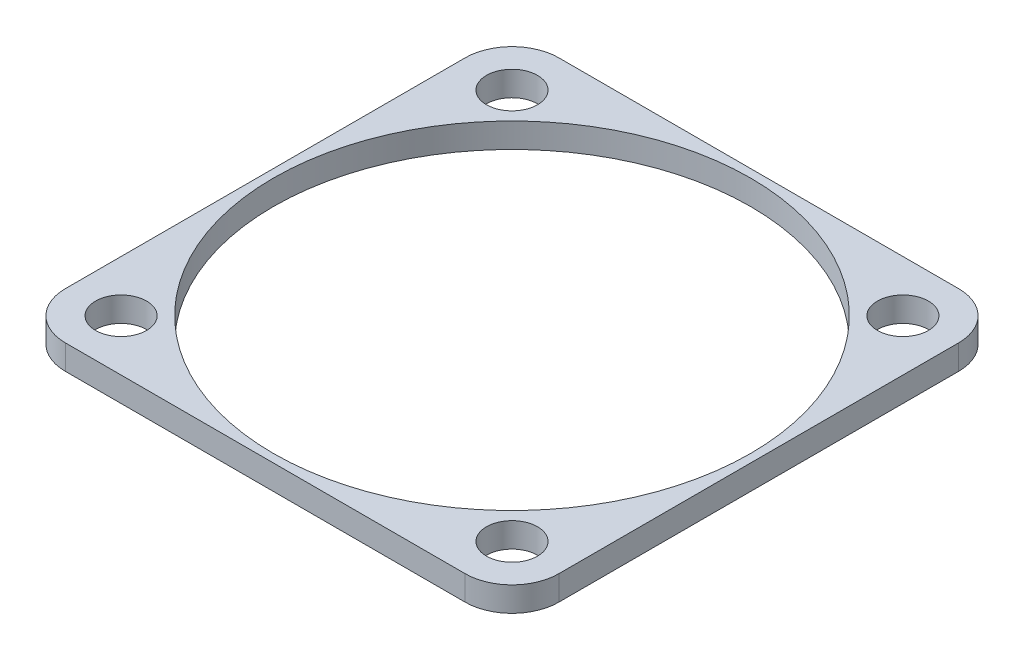
ISO-10303-21;
HEADER;
FILE_DESCRIPTION(('STEP AP214'),'2;1');
FILE_NAME('part.step','',(''),(''),'','','');
FILE_SCHEMA(('AUTOMOTIVE_DESIGN { 1 0 10303 214 1 1 1 1 }'));
ENDSEC;
DATA;
#1=APPLICATION_CONTEXT('core data for automotive mechanical design processes');
#2=APPLICATION_PROTOCOL_DEFINITION('international standard','automotive_design',2000,#1);
#3=PRODUCT_CONTEXT('',#1,'mechanical');
#4=PRODUCT('Part','Part','',(#3));
#5=PRODUCT_RELATED_PRODUCT_CATEGORY('part','',(#4));
#6=PRODUCT_DEFINITION_FORMATION('','',#4);
#7=PRODUCT_DEFINITION_CONTEXT('part definition',#1,'design');
#8=PRODUCT_DEFINITION('design','',#6,#7);
#9=PRODUCT_DEFINITION_SHAPE('','',#8);
#10=(LENGTH_UNIT() NAMED_UNIT(*) SI_UNIT(.MILLI.,.METRE.));
#11=(NAMED_UNIT(*) PLANE_ANGLE_UNIT() SI_UNIT($,.RADIAN.));
#12=(NAMED_UNIT(*) SI_UNIT($,.STERADIAN.) SOLID_ANGLE_UNIT());
#13=UNCERTAINTY_MEASURE_WITH_UNIT(LENGTH_MEASURE(1.E-05),#10,'distance_accuracy_value','');
#14=(GEOMETRIC_REPRESENTATION_CONTEXT(3) GLOBAL_UNCERTAINTY_ASSIGNED_CONTEXT((#13)) GLOBAL_UNIT_ASSIGNED_CONTEXT((#10,
#11,#12)) REPRESENTATION_CONTEXT('',''));
#15=CARTESIAN_POINT('',(0.,0.,0.));
#16=DIRECTION('',(0.,0.,1.));
#17=DIRECTION('',(1.,0.,0.));
#18=AXIS2_PLACEMENT_3D('',#15,#16,#17);
#19=CARTESIAN_POINT('',(0.,1.5,0.));
#20=DIRECTION('',(0.,-1.,0.));
#21=DIRECTION('',(0.,0.,-1.));
#22=AXIS2_PLACEMENT_3D('',#19,#20,#21);
#23=PLANE('',#22);
#24=DIRECTION('',(0.,0.,-1.));
#25=VECTOR('',#24,1.);
#26=CARTESIAN_POINT('',(14.9999999999998,1.5,-15.0000000000001));
#27=LINE('',#26,#25);
#28=CARTESIAN_POINT('',(14.9999999999996,1.5,12.15));
#29=VERTEX_POINT('',#28);
#30=CARTESIAN_POINT('',(14.9999999999997,1.5,-12.15));
#31=VERTEX_POINT('',#30);
#32=EDGE_CURVE('E194',#29,#31,#27,.T.);
#33=ORIENTED_EDGE('',*,*,#32,.T.);
#34=CARTESIAN_POINT('',(12.1499999999997,1.5,-12.15));
#35=DIRECTION('',(0.,-1.,0.));
#36=DIRECTION('',(0.,0.,-1.));
#37=AXIS2_PLACEMENT_3D('',#34,#35,#36);
#38=CIRCLE('',#37,2.85);
#39=CARTESIAN_POINT('',(12.1499999999997,1.5,-15.));
#40=VERTEX_POINT('',#39);
#41=EDGE_CURVE('E167',#31,#40,#38,.F.);
#42=ORIENTED_EDGE('',*,*,#41,.T.);
#43=DIRECTION('',(-1.,0.,0.));
#44=VECTOR('',#43,1.);
#45=CARTESIAN_POINT('',(-15.,1.5,-14.9999999999999));
#46=LINE('',#45,#44);
#47=CARTESIAN_POINT('',(-12.15,1.5,-14.9999999999999));
#48=VERTEX_POINT('',#47);
#49=EDGE_CURVE('E124',#40,#48,#46,.T.);
#50=ORIENTED_EDGE('',*,*,#49,.T.);
#51=CARTESIAN_POINT('',(-12.15,1.5,-12.1499999999999));
#52=DIRECTION('',(0.,-1.,0.));
#53=DIRECTION('',(0.,0.,-1.));
#54=AXIS2_PLACEMENT_3D('',#51,#52,#53);
#55=CIRCLE('',#54,2.85);
#56=CARTESIAN_POINT('',(-15.,1.5,-12.1499999999999));
#57=VERTEX_POINT('',#56);
#58=EDGE_CURVE('E59',#48,#57,#55,.F.);
#59=ORIENTED_EDGE('',*,*,#58,.T.);
#60=DIRECTION('',(0.,0.,1.));
#61=VECTOR('',#60,1.);
#62=CARTESIAN_POINT('',(-15.,1.5,-14.9999999999999));
#63=LINE('',#62,#61);
#64=CARTESIAN_POINT('',(-15.,1.5,12.15));
#65=VERTEX_POINT('',#64);
#66=EDGE_CURVE('E145',#57,#65,#63,.T.);
#67=ORIENTED_EDGE('',*,*,#66,.T.);
#68=CARTESIAN_POINT('',(-12.15,1.5,12.15));
#69=DIRECTION('',(0.,-1.,0.));
#70=DIRECTION('',(0.,0.,-1.));
#71=AXIS2_PLACEMENT_3D('',#68,#69,#70);
#72=CIRCLE('',#71,2.85);
#73=CARTESIAN_POINT('',(-12.15,1.5,15.));
#74=VERTEX_POINT('',#73);
#75=EDGE_CURVE('E161',#65,#74,#72,.F.);
#76=ORIENTED_EDGE('',*,*,#75,.T.);
#77=DIRECTION('',(1.,0.,0.));
#78=VECTOR('',#77,1.);
#79=CARTESIAN_POINT('',(-15.,1.5,15.));
#80=LINE('',#79,#78);
#81=CARTESIAN_POINT('',(12.1499999999996,1.5,15.));
#82=VERTEX_POINT('',#81);
#83=EDGE_CURVE('E138',#74,#82,#80,.T.);
#84=ORIENTED_EDGE('',*,*,#83,.T.);
#85=CARTESIAN_POINT('',(12.1499999999996,1.5,12.15));
#86=DIRECTION('',(0.,-1.,0.));
#87=DIRECTION('',(0.,0.,-1.));
#88=AXIS2_PLACEMENT_3D('',#85,#86,#87);
#89=CIRCLE('',#88,2.85);
#90=EDGE_CURVE('E164',#82,#29,#89,.F.);
#91=ORIENTED_EDGE('',*,*,#90,.T.);
#92=EDGE_LOOP('',(#33,#42,#50,#59,#67,#76,#84,#91));
#93=FACE_BOUND('',#92,.T.);
#94=CARTESIAN_POINT('',(0.,1.5,0.));
#95=DIRECTION('',(0.,1.,0.));
#96=DIRECTION('',(0.,0.,1.));
#97=AXIS2_PLACEMENT_3D('',#94,#95,#96);
#98=CIRCLE('',#97,14.5);
#99=CARTESIAN_POINT('',(0.,1.5,14.5));
#100=VERTEX_POINT('',#99);
#101=EDGE_CURVE('E207',#100,#100,#98,.T.);
#102=ORIENTED_EDGE('',*,*,#101,.F.);
#103=EDGE_LOOP('',(#102));
#104=FACE_BOUND('',#103,.T.);
#105=CARTESIAN_POINT('',(-11.879393923934,1.5,-11.879393923934));
#106=DIRECTION('',(0.,1.,0.));
#107=DIRECTION('',(0.,0.,1.));
#108=AXIS2_PLACEMENT_3D('',#105,#106,#107);
#109=CIRCLE('',#108,1.55);
#110=CARTESIAN_POINT('',(-11.879393923934,1.5,-10.329393923934));
#111=VERTEX_POINT('',#110);
#112=EDGE_CURVE('E214',#111,#111,#109,.T.);
#113=ORIENTED_EDGE('',*,*,#112,.F.);
#114=EDGE_LOOP('',(#113));
#115=FACE_BOUND('',#114,.T.);
#116=CARTESIAN_POINT('',(11.879393923934,1.5,-11.8793939239346));
#117=DIRECTION('',(0.,1.,0.));
#118=DIRECTION('',(0.,0.,1.));
#119=AXIS2_PLACEMENT_3D('',#116,#117,#118);
#120=CIRCLE('',#119,1.55000000000069);
#121=CARTESIAN_POINT('',(11.879393923934,1.5,-10.329393923934));
#122=VERTEX_POINT('',#121);
#123=EDGE_CURVE('E220',#122,#122,#120,.T.);
#124=ORIENTED_EDGE('',*,*,#123,.F.);
#125=EDGE_LOOP('',(#124));
#126=FACE_BOUND('',#125,.T.);
#127=CARTESIAN_POINT('',(11.8793939239347,1.5,11.8793939239333));
#128=DIRECTION('',(0.,1.,0.));
#129=DIRECTION('',(0.,0.,1.));
#130=AXIS2_PLACEMENT_3D('',#127,#128,#129);
#131=CIRCLE('',#130,1.55000000000094);
#132=CARTESIAN_POINT('',(11.8793939239347,1.5,13.4293939239343));
#133=VERTEX_POINT('',#132);
#134=EDGE_CURVE('E228',#133,#133,#131,.T.);
#135=ORIENTED_EDGE('',*,*,#134,.F.);
#136=EDGE_LOOP('',(#135));
#137=FACE_BOUND('',#136,.T.);
#138=CARTESIAN_POINT('',(-11.8793939239333,1.5,11.879393923934));
#139=DIRECTION('',(0.,1.,0.));
#140=DIRECTION('',(0.,0.,1.));
#141=AXIS2_PLACEMENT_3D('',#138,#139,#140);
#142=CIRCLE('',#141,1.55000000000035);
#143=CARTESIAN_POINT('',(-11.8793939239333,1.5,13.4293939239343));
#144=VERTEX_POINT('',#143);
#145=EDGE_CURVE('E236',#144,#144,#142,.T.);
#146=ORIENTED_EDGE('',*,*,#145,.F.);
#147=EDGE_LOOP('',(#146));
#148=FACE_BOUND('',#147,.T.);
#149=ADVANCED_FACE('F38',(#93,#104,#115,#126,#137,#148),#23,.F.);
#150=CARTESIAN_POINT('',(0.,0.,0.));
#151=DIRECTION('',(0.,-1.,0.));
#152=DIRECTION('',(0.,0.,-1.));
#153=AXIS2_PLACEMENT_3D('',#150,#151,#152);
#154=PLANE('',#153);
#155=CARTESIAN_POINT('',(11.8793939239347,0.,11.8793939239333));
#156=DIRECTION('',(0.,1.,0.));
#157=DIRECTION('',(0.,0.,1.));
#158=AXIS2_PLACEMENT_3D('',#155,#156,#157);
#159=CIRCLE('',#158,1.55000000000094);
#160=CARTESIAN_POINT('',(11.8793939239347,0.,13.4293939239343));
#161=VERTEX_POINT('',#160);
#162=EDGE_CURVE('E232',#161,#161,#159,.T.);
#163=ORIENTED_EDGE('',*,*,#162,.T.);
#164=EDGE_LOOP('',(#163));
#165=FACE_BOUND('',#164,.T.);
#166=CARTESIAN_POINT('',(-11.879393923934,0.,-11.879393923934));
#167=DIRECTION('',(0.,1.,0.));
#168=DIRECTION('',(0.,0.,1.));
#169=AXIS2_PLACEMENT_3D('',#166,#167,#168);
#170=CIRCLE('',#169,1.55);
#171=CARTESIAN_POINT('',(-11.879393923934,0.,-10.329393923934));
#172=VERTEX_POINT('',#171);
#173=EDGE_CURVE('E216',#172,#172,#170,.T.);
#174=ORIENTED_EDGE('',*,*,#173,.T.);
#175=EDGE_LOOP('',(#174));
#176=FACE_BOUND('',#175,.T.);
#177=DIRECTION('',(-1.,0.,0.));
#178=VECTOR('',#177,1.);
#179=CARTESIAN_POINT('',(-15.,0.,-14.9999999999999));
#180=LINE('',#179,#178);
#181=CARTESIAN_POINT('',(12.1499999999997,0.,-15.));
#182=VERTEX_POINT('',#181);
#183=CARTESIAN_POINT('',(-12.15,0.,-14.9999999999999));
#184=VERTEX_POINT('',#183);
#185=EDGE_CURVE('E122',#182,#184,#180,.T.);
#186=ORIENTED_EDGE('',*,*,#185,.F.);
#187=CARTESIAN_POINT('',(12.1499999999997,0.,-12.15));
#188=DIRECTION('',(0.,-1.,0.));
#189=DIRECTION('',(0.,0.,-1.));
#190=AXIS2_PLACEMENT_3D('',#187,#188,#189);
#191=CIRCLE('',#190,2.85);
#192=CARTESIAN_POINT('',(14.9999999999997,0.,-12.15));
#193=VERTEX_POINT('',#192);
#194=EDGE_CURVE('E104',#182,#193,#191,.T.);
#195=ORIENTED_EDGE('',*,*,#194,.T.);
#196=DIRECTION('',(0.,0.,-1.));
#197=VECTOR('',#196,1.);
#198=CARTESIAN_POINT('',(14.9999999999998,0.,-15.0000000000001));
#199=LINE('',#198,#197);
#200=CARTESIAN_POINT('',(14.9999999999996,0.,12.15));
#201=VERTEX_POINT('',#200);
#202=EDGE_CURVE('E134',#201,#193,#199,.T.);
#203=ORIENTED_EDGE('',*,*,#202,.F.);
#204=CARTESIAN_POINT('',(12.1499999999996,0.,12.15));
#205=DIRECTION('',(0.,-1.,0.));
#206=DIRECTION('',(0.,0.,-1.));
#207=AXIS2_PLACEMENT_3D('',#204,#205,#206);
#208=CIRCLE('',#207,2.85);
#209=CARTESIAN_POINT('',(12.1499999999996,0.,15.));
#210=VERTEX_POINT('',#209);
#211=EDGE_CURVE('E116',#201,#210,#208,.T.);
#212=ORIENTED_EDGE('',*,*,#211,.T.);
#213=DIRECTION('',(1.,0.,0.));
#214=VECTOR('',#213,1.);
#215=CARTESIAN_POINT('',(-15.,0.,15.));
#216=LINE('',#215,#214);
#217=CARTESIAN_POINT('',(-12.15,0.,15.));
#218=VERTEX_POINT('',#217);
#219=EDGE_CURVE('E140',#218,#210,#216,.T.);
#220=ORIENTED_EDGE('',*,*,#219,.F.);
#221=CARTESIAN_POINT('',(-12.15,0.,12.15));
#222=DIRECTION('',(0.,-1.,0.));
#223=DIRECTION('',(0.,0.,-1.));
#224=AXIS2_PLACEMENT_3D('',#221,#222,#223);
#225=CIRCLE('',#224,2.85);
#226=CARTESIAN_POINT('',(-15.,0.,12.15));
#227=VERTEX_POINT('',#226);
#228=EDGE_CURVE('E149',#218,#227,#225,.T.);
#229=ORIENTED_EDGE('',*,*,#228,.T.);
#230=DIRECTION('',(0.,0.,1.));
#231=VECTOR('',#230,1.);
#232=CARTESIAN_POINT('',(-15.,0.,-14.9999999999999));
#233=LINE('',#232,#231);
#234=CARTESIAN_POINT('',(-15.,0.,-12.1499999999999));
#235=VERTEX_POINT('',#234);
#236=EDGE_CURVE('E133',#235,#227,#233,.T.);
#237=ORIENTED_EDGE('',*,*,#236,.F.);
#238=CARTESIAN_POINT('',(-12.15,0.,-12.1499999999999));
#239=DIRECTION('',(0.,-1.,0.));
#240=DIRECTION('',(0.,0.,-1.));
#241=AXIS2_PLACEMENT_3D('',#238,#239,#240);
#242=CIRCLE('',#241,2.85);
#243=EDGE_CURVE('E126',#235,#184,#242,.T.);
#244=ORIENTED_EDGE('',*,*,#243,.T.);
#245=EDGE_LOOP('',(#186,#195,#203,#212,#220,#229,#237,#244));
#246=FACE_BOUND('',#245,.T.);
#247=CARTESIAN_POINT('',(0.,0.,0.));
#248=DIRECTION('',(0.,1.,0.));
#249=DIRECTION('',(0.,0.,1.));
#250=AXIS2_PLACEMENT_3D('',#247,#248,#249);
#251=CIRCLE('',#250,14.5);
#252=CARTESIAN_POINT('',(0.,0.,14.5));
#253=VERTEX_POINT('',#252);
#254=EDGE_CURVE('E200',#253,#253,#251,.T.);
#255=ORIENTED_EDGE('',*,*,#254,.T.);
#256=EDGE_LOOP('',(#255));
#257=FACE_BOUND('',#256,.T.);
#258=CARTESIAN_POINT('',(11.879393923934,0.,-11.8793939239346));
#259=DIRECTION('',(0.,1.,0.));
#260=DIRECTION('',(0.,0.,1.));
#261=AXIS2_PLACEMENT_3D('',#258,#259,#260);
#262=CIRCLE('',#261,1.55000000000069);
#263=CARTESIAN_POINT('',(11.879393923934,0.,-10.329393923934));
#264=VERTEX_POINT('',#263);
#265=EDGE_CURVE('E224',#264,#264,#262,.T.);
#266=ORIENTED_EDGE('',*,*,#265,.T.);
#267=EDGE_LOOP('',(#266));
#268=FACE_BOUND('',#267,.T.);
#269=CARTESIAN_POINT('',(-11.8793939239333,0.,11.879393923934));
#270=DIRECTION('',(0.,1.,0.));
#271=DIRECTION('',(0.,0.,1.));
#272=AXIS2_PLACEMENT_3D('',#269,#270,#271);
#273=CIRCLE('',#272,1.55000000000035);
#274=CARTESIAN_POINT('',(-11.8793939239333,0.,13.4293939239343));
#275=VERTEX_POINT('',#274);
#276=EDGE_CURVE('E240',#275,#275,#273,.T.);
#277=ORIENTED_EDGE('',*,*,#276,.T.);
#278=EDGE_LOOP('',(#277));
#279=FACE_BOUND('',#278,.T.);
#280=ADVANCED_FACE('F129',(#165,#176,#246,#257,#268,#279),#154,.T.);
#281=CARTESIAN_POINT('',(-15.,1.5,15.));
#282=DIRECTION('',(0.,0.,-1.));
#283=DIRECTION('',(-1.,0.,0.));
#284=AXIS2_PLACEMENT_3D('',#281,#282,#283);
#285=PLANE('',#284);
#286=ORIENTED_EDGE('',*,*,#219,.T.);
#287=DIRECTION('',(0.,-1.,0.));
#288=VECTOR('',#287,1.);
#289=CARTESIAN_POINT('',(12.1499999999996,1.5,15.));
#290=LINE('',#289,#288);
#291=EDGE_CURVE('E174',#210,#82,#290,.F.);
#292=ORIENTED_EDGE('',*,*,#291,.T.);
#293=ORIENTED_EDGE('',*,*,#83,.F.);
#294=DIRECTION('',(0.,-1.,0.));
#295=VECTOR('',#294,1.);
#296=CARTESIAN_POINT('',(-12.15,1.5,15.));
#297=LINE('',#296,#295);
#298=EDGE_CURVE('E170',#74,#218,#297,.T.);
#299=ORIENTED_EDGE('',*,*,#298,.T.);
#300=EDGE_LOOP('',(#286,#292,#293,#299));
#301=FACE_BOUND('',#300,.T.);
#302=ADVANCED_FACE('F189',(#301),#285,.F.);
#303=CARTESIAN_POINT('',(14.9999999999998,1.5,-15.0000000000001));
#304=DIRECTION('',(-1.,0.,0.));
#305=DIRECTION('',(0.,0.,1.));
#306=AXIS2_PLACEMENT_3D('',#303,#304,#305);
#307=PLANE('',#306);
#308=ORIENTED_EDGE('',*,*,#202,.T.);
#309=DIRECTION('',(0.,-1.,0.));
#310=VECTOR('',#309,1.);
#311=CARTESIAN_POINT('',(14.9999999999997,1.5,-12.15));
#312=LINE('',#311,#310);
#313=EDGE_CURVE('E109',#193,#31,#312,.F.);
#314=ORIENTED_EDGE('',*,*,#313,.T.);
#315=ORIENTED_EDGE('',*,*,#32,.F.);
#316=DIRECTION('',(0.,-1.,0.));
#317=VECTOR('',#316,1.);
#318=CARTESIAN_POINT('',(14.9999999999996,1.5,12.15));
#319=LINE('',#318,#317);
#320=EDGE_CURVE('E115',#29,#201,#319,.T.);
#321=ORIENTED_EDGE('',*,*,#320,.T.);
#322=EDGE_LOOP('',(#308,#314,#315,#321));
#323=FACE_BOUND('',#322,.T.);
#324=ADVANCED_FACE('F268',(#323),#307,.F.);
#325=CARTESIAN_POINT('',(-15.,1.5,-14.9999999999999));
#326=DIRECTION('',(0.,0.,1.));
#327=DIRECTION('',(1.,0.,0.));
#328=AXIS2_PLACEMENT_3D('',#325,#326,#327);
#329=PLANE('',#328);
#330=ORIENTED_EDGE('',*,*,#49,.F.);
#331=DIRECTION('',(0.,-1.,0.));
#332=VECTOR('',#331,1.);
#333=CARTESIAN_POINT('',(12.1499999999997,1.5,-15.));
#334=LINE('',#333,#332);
#335=EDGE_CURVE('E108',#40,#182,#334,.T.);
#336=ORIENTED_EDGE('',*,*,#335,.T.);
#337=ORIENTED_EDGE('',*,*,#185,.T.);
#338=DIRECTION('',(0.,-1.,0.));
#339=VECTOR('',#338,1.);
#340=CARTESIAN_POINT('',(-12.15,1.5,-14.9999999999999));
#341=LINE('',#340,#339);
#342=EDGE_CURVE('E127',#184,#48,#341,.F.);
#343=ORIENTED_EDGE('',*,*,#342,.T.);
#344=EDGE_LOOP('',(#330,#336,#337,#343));
#345=FACE_BOUND('',#344,.T.);
#346=ADVANCED_FACE('F121',(#345),#329,.F.);
#347=CARTESIAN_POINT('',(-15.,1.5,-14.9999999999999));
#348=DIRECTION('',(1.,0.,0.));
#349=DIRECTION('',(0.,0.,-1.));
#350=AXIS2_PLACEMENT_3D('',#347,#348,#349);
#351=PLANE('',#350);
#352=ORIENTED_EDGE('',*,*,#236,.T.);
#353=DIRECTION('',(0.,-1.,0.));
#354=VECTOR('',#353,1.);
#355=CARTESIAN_POINT('',(-15.,1.5,12.15));
#356=LINE('',#355,#354);
#357=EDGE_CURVE('E11',#227,#65,#356,.F.);
#358=ORIENTED_EDGE('',*,*,#357,.T.);
#359=ORIENTED_EDGE('',*,*,#66,.F.);
#360=DIRECTION('',(0.,-1.,0.));
#361=VECTOR('',#360,1.);
#362=CARTESIAN_POINT('',(-15.,1.5,-12.1499999999999));
#363=LINE('',#362,#361);
#364=EDGE_CURVE('E47',#57,#235,#363,.T.);
#365=ORIENTED_EDGE('',*,*,#364,.T.);
#366=EDGE_LOOP('',(#352,#358,#359,#365));
#367=FACE_BOUND('',#366,.T.);
#368=ADVANCED_FACE('F179',(#367),#351,.F.);
#369=CARTESIAN_POINT('',(0.,1.5,0.));
#370=DIRECTION('',(0.,-1.,0.));
#371=DIRECTION('',(0.,0.,-1.));
#372=AXIS2_PLACEMENT_3D('',#369,#370,#371);
#373=CYLINDRICAL_SURFACE('',#372,14.5);
#374=ORIENTED_EDGE('',*,*,#101,.T.);
#375=EDGE_LOOP('',(#374));
#376=FACE_BOUND('',#375,.T.);
#377=ORIENTED_EDGE('',*,*,#254,.F.);
#378=EDGE_LOOP('',(#377));
#379=FACE_BOUND('',#378,.T.);
#380=ADVANCED_FACE('F261',(#376,#379),#373,.F.);
#381=CARTESIAN_POINT('',(-11.879393923934,1.5,-11.879393923934));
#382=DIRECTION('',(0.,-1.,0.));
#383=DIRECTION('',(0.,0.,-1.));
#384=AXIS2_PLACEMENT_3D('',#381,#382,#383);
#385=CYLINDRICAL_SURFACE('',#384,1.55);
#386=ORIENTED_EDGE('',*,*,#112,.T.);
#387=EDGE_LOOP('',(#386));
#388=FACE_BOUND('',#387,.T.);
#389=ORIENTED_EDGE('',*,*,#173,.F.);
#390=EDGE_LOOP('',(#389));
#391=FACE_BOUND('',#390,.T.);
#392=ADVANCED_FACE('F349',(#388,#391),#385,.F.);
#393=CARTESIAN_POINT('',(11.879393923934,1.5,-11.8793939239346));
#394=DIRECTION('',(0.,-1.,0.));
#395=DIRECTION('',(0.,0.,-1.));
#396=AXIS2_PLACEMENT_3D('',#393,#394,#395);
#397=CYLINDRICAL_SURFACE('',#396,1.55000000000069);
#398=ORIENTED_EDGE('',*,*,#123,.T.);
#399=EDGE_LOOP('',(#398));
#400=FACE_BOUND('',#399,.T.);
#401=ORIENTED_EDGE('',*,*,#265,.F.);
#402=EDGE_LOOP('',(#401));
#403=FACE_BOUND('',#402,.T.);
#404=ADVANCED_FACE('F356',(#400,#403),#397,.F.);
#405=CARTESIAN_POINT('',(11.8793939239347,1.5,11.8793939239333));
#406=DIRECTION('',(0.,-1.,0.));
#407=DIRECTION('',(0.,0.,-1.));
#408=AXIS2_PLACEMENT_3D('',#405,#406,#407);
#409=CYLINDRICAL_SURFACE('',#408,1.55000000000094);
#410=ORIENTED_EDGE('',*,*,#134,.T.);
#411=EDGE_LOOP('',(#410));
#412=FACE_BOUND('',#411,.T.);
#413=ORIENTED_EDGE('',*,*,#162,.F.);
#414=EDGE_LOOP('',(#413));
#415=FACE_BOUND('',#414,.T.);
#416=ADVANCED_FACE('F364',(#412,#415),#409,.F.);
#417=CARTESIAN_POINT('',(-11.8793939239333,1.5,11.879393923934));
#418=DIRECTION('',(0.,-1.,0.));
#419=DIRECTION('',(0.,0.,-1.));
#420=AXIS2_PLACEMENT_3D('',#417,#418,#419);
#421=CYLINDRICAL_SURFACE('',#420,1.55000000000035);
#422=ORIENTED_EDGE('',*,*,#145,.T.);
#423=EDGE_LOOP('',(#422));
#424=FACE_BOUND('',#423,.T.);
#425=ORIENTED_EDGE('',*,*,#276,.F.);
#426=EDGE_LOOP('',(#425));
#427=FACE_BOUND('',#426,.T.);
#428=ADVANCED_FACE('F248',(#424,#427),#421,.F.);
#429=CARTESIAN_POINT('',(12.1499999999997,1.5,-12.15));
#430=DIRECTION('',(0.,-1.,0.));
#431=DIRECTION('',(0.,0.,-1.));
#432=AXIS2_PLACEMENT_3D('',#429,#430,#431);
#433=CYLINDRICAL_SURFACE('',#432,2.85);
#434=ORIENTED_EDGE('',*,*,#41,.F.);
#435=ORIENTED_EDGE('',*,*,#313,.F.);
#436=ORIENTED_EDGE('',*,*,#194,.F.);
#437=ORIENTED_EDGE('',*,*,#335,.F.);
#438=EDGE_LOOP('',(#434,#435,#436,#437));
#439=FACE_BOUND('',#438,.T.);
#440=ADVANCED_FACE('F107',(#439),#433,.T.);
#441=CARTESIAN_POINT('',(12.1499999999996,1.5,12.15));
#442=DIRECTION('',(0.,-1.,0.));
#443=DIRECTION('',(0.,0.,-1.));
#444=AXIS2_PLACEMENT_3D('',#441,#442,#443);
#445=CYLINDRICAL_SURFACE('',#444,2.85);
#446=ORIENTED_EDGE('',*,*,#90,.F.);
#447=ORIENTED_EDGE('',*,*,#291,.F.);
#448=ORIENTED_EDGE('',*,*,#211,.F.);
#449=ORIENTED_EDGE('',*,*,#320,.F.);
#450=EDGE_LOOP('',(#446,#447,#448,#449));
#451=FACE_BOUND('',#450,.T.);
#452=ADVANCED_FACE('F276',(#451),#445,.T.);
#453=CARTESIAN_POINT('',(-12.15,1.5,12.15));
#454=DIRECTION('',(0.,-1.,0.));
#455=DIRECTION('',(0.,0.,-1.));
#456=AXIS2_PLACEMENT_3D('',#453,#454,#455);
#457=CYLINDRICAL_SURFACE('',#456,2.85);
#458=ORIENTED_EDGE('',*,*,#75,.F.);
#459=ORIENTED_EDGE('',*,*,#357,.F.);
#460=ORIENTED_EDGE('',*,*,#228,.F.);
#461=ORIENTED_EDGE('',*,*,#298,.F.);
#462=EDGE_LOOP('',(#458,#459,#460,#461));
#463=FACE_BOUND('',#462,.T.);
#464=ADVANCED_FACE('F186',(#463),#457,.T.);
#465=CARTESIAN_POINT('',(-12.15,1.5,-12.1499999999999));
#466=DIRECTION('',(0.,-1.,0.));
#467=DIRECTION('',(0.,0.,-1.));
#468=AXIS2_PLACEMENT_3D('',#465,#466,#467);
#469=CYLINDRICAL_SURFACE('',#468,2.85);
#470=ORIENTED_EDGE('',*,*,#58,.F.);
#471=ORIENTED_EDGE('',*,*,#342,.F.);
#472=ORIENTED_EDGE('',*,*,#243,.F.);
#473=ORIENTED_EDGE('',*,*,#364,.F.);
#474=EDGE_LOOP('',(#470,#471,#472,#473));
#475=FACE_BOUND('',#474,.T.);
#476=ADVANCED_FACE('F40',(#475),#469,.T.);
#477=CLOSED_SHELL('',(#149,#280,#302,#324,#346,#368,#380,#392,#404,#416,#428,#440,#452,#464,#476));
#478=MANIFOLD_SOLID_BREP('B2',#477);
#479=ADVANCED_BREP_SHAPE_REPRESENTATION('',(#18,#478),#14);
#480=SHAPE_DEFINITION_REPRESENTATION(#9,#479);
ENDSEC;
END-ISO-10303-21;
